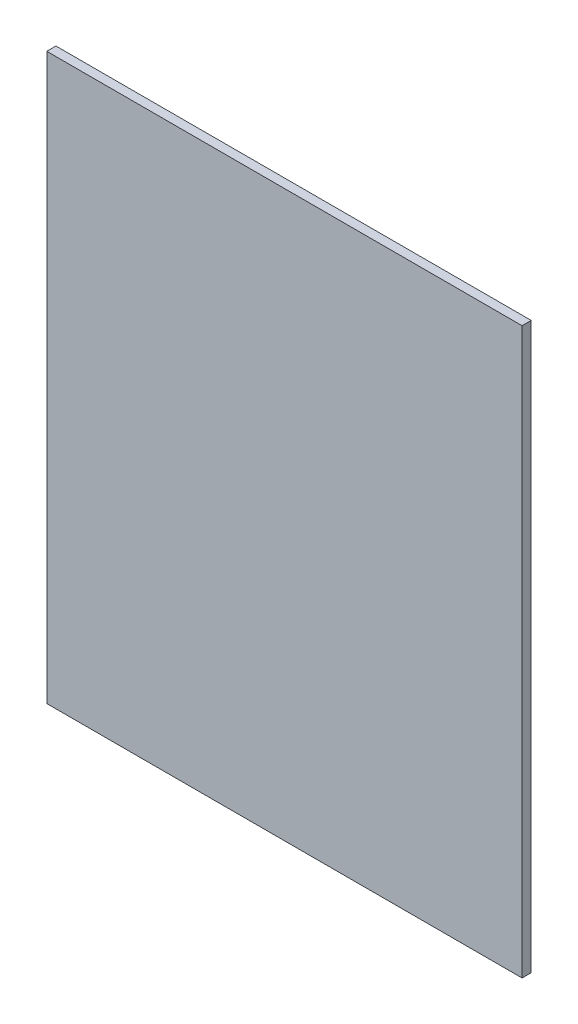
ISO-10303-21;
HEADER;
FILE_DESCRIPTION(('STEP AP214'),'2;1');
FILE_NAME('part.step','',(''),(''),'','','');
FILE_SCHEMA(('AUTOMOTIVE_DESIGN { 1 0 10303 214 1 1 1 1 }'));
ENDSEC;
DATA;
#1=APPLICATION_CONTEXT('core data for automotive mechanical design processes');
#2=APPLICATION_PROTOCOL_DEFINITION('international standard','automotive_design',2000,#1);
#3=PRODUCT_CONTEXT('',#1,'mechanical');
#4=PRODUCT('Part','Part','',(#3));
#5=PRODUCT_RELATED_PRODUCT_CATEGORY('part','',(#4));
#6=PRODUCT_DEFINITION_FORMATION('','',#4);
#7=PRODUCT_DEFINITION_CONTEXT('part definition',#1,'design');
#8=PRODUCT_DEFINITION('design','',#6,#7);
#9=PRODUCT_DEFINITION_SHAPE('','',#8);
#10=(LENGTH_UNIT() NAMED_UNIT(*) SI_UNIT(.MILLI.,.METRE.));
#11=(NAMED_UNIT(*) PLANE_ANGLE_UNIT() SI_UNIT($,.RADIAN.));
#12=(NAMED_UNIT(*) SI_UNIT($,.STERADIAN.) SOLID_ANGLE_UNIT());
#13=UNCERTAINTY_MEASURE_WITH_UNIT(LENGTH_MEASURE(1.E-05),#10,'distance_accuracy_value','');
#14=(GEOMETRIC_REPRESENTATION_CONTEXT(3) GLOBAL_UNCERTAINTY_ASSIGNED_CONTEXT((#13)) GLOBAL_UNIT_ASSIGNED_CONTEXT((#10,
#11,#12)) REPRESENTATION_CONTEXT('',''));
#15=CARTESIAN_POINT('',(0.,0.,0.));
#16=DIRECTION('',(0.,0.,1.));
#17=DIRECTION('',(1.,0.,0.));
#18=AXIS2_PLACEMENT_3D('',#15,#16,#17);
#19=CARTESIAN_POINT('',(-130.,-154.5,5.));
#20=DIRECTION('',(1.,0.,0.));
#21=DIRECTION('',(0.,0.,-1.));
#22=AXIS2_PLACEMENT_3D('',#19,#20,#21);
#23=PLANE('',#22);
#24=DIRECTION('',(0.,-1.,0.));
#25=VECTOR('',#24,1.);
#26=CARTESIAN_POINT('',(-130.,-154.5,0.));
#27=LINE('',#26,#25);
#28=CARTESIAN_POINT('',(-130.,154.5,0.));
#29=VERTEX_POINT('',#28);
#30=CARTESIAN_POINT('',(-130.,-154.5,0.));
#31=VERTEX_POINT('',#30);
#32=EDGE_CURVE('E96',#29,#31,#27,.T.);
#33=ORIENTED_EDGE('',*,*,#32,.T.);
#34=DIRECTION('',(0.,0.,-1.));
#35=VECTOR('',#34,1.);
#36=CARTESIAN_POINT('',(-130.,-154.5,5.));
#37=LINE('',#36,#35);
#38=CARTESIAN_POINT('',(-130.,-154.5,5.));
#39=VERTEX_POINT('',#38);
#40=EDGE_CURVE('E11',#39,#31,#37,.T.);
#41=ORIENTED_EDGE('',*,*,#40,.F.);
#42=DIRECTION('',(0.,-1.,0.));
#43=VECTOR('',#42,1.);
#44=CARTESIAN_POINT('',(-130.,-154.5,5.));
#45=LINE('',#44,#43);
#46=CARTESIAN_POINT('',(-130.,154.5,5.));
#47=VERTEX_POINT('',#46);
#48=EDGE_CURVE('E84',#47,#39,#45,.T.);
#49=ORIENTED_EDGE('',*,*,#48,.F.);
#50=DIRECTION('',(0.,0.,-1.));
#51=VECTOR('',#50,1.);
#52=CARTESIAN_POINT('',(-130.,154.5,5.));
#53=LINE('',#52,#51);
#54=EDGE_CURVE('E92',#47,#29,#53,.T.);
#55=ORIENTED_EDGE('',*,*,#54,.T.);
#56=EDGE_LOOP('',(#33,#41,#49,#55));
#57=FACE_BOUND('',#56,.T.);
#58=ADVANCED_FACE('F33',(#57),#23,.F.);
#59=CARTESIAN_POINT('',(130.,-154.5,5.));
#60=DIRECTION('',(0.,1.,0.));
#61=DIRECTION('',(0.,0.,1.));
#62=AXIS2_PLACEMENT_3D('',#59,#60,#61);
#63=PLANE('',#62);
#64=DIRECTION('',(1.,0.,0.));
#65=VECTOR('',#64,1.);
#66=CARTESIAN_POINT('',(130.,-154.5,0.));
#67=LINE('',#66,#65);
#68=CARTESIAN_POINT('',(130.,-154.5,0.));
#69=VERTEX_POINT('',#68);
#70=EDGE_CURVE('E88',#31,#69,#67,.T.);
#71=ORIENTED_EDGE('',*,*,#70,.T.);
#72=DIRECTION('',(0.,0.,-1.));
#73=VECTOR('',#72,1.);
#74=CARTESIAN_POINT('',(130.,-154.5,5.));
#75=LINE('',#74,#73);
#76=CARTESIAN_POINT('',(130.,-154.5,5.));
#77=VERTEX_POINT('',#76);
#78=EDGE_CURVE('E41',#77,#69,#75,.T.);
#79=ORIENTED_EDGE('',*,*,#78,.F.);
#80=DIRECTION('',(1.,0.,0.));
#81=VECTOR('',#80,1.);
#82=CARTESIAN_POINT('',(130.,-154.5,5.));
#83=LINE('',#82,#81);
#84=EDGE_CURVE('E79',#39,#77,#83,.T.);
#85=ORIENTED_EDGE('',*,*,#84,.F.);
#86=ORIENTED_EDGE('',*,*,#40,.T.);
#87=EDGE_LOOP('',(#71,#79,#85,#86));
#88=FACE_BOUND('',#87,.T.);
#89=ADVANCED_FACE('F87',(#88),#63,.F.);
#90=CARTESIAN_POINT('',(130.,-154.5,5.));
#91=DIRECTION('',(-1.,0.,0.));
#92=DIRECTION('',(0.,0.,1.));
#93=AXIS2_PLACEMENT_3D('',#90,#91,#92);
#94=PLANE('',#93);
#95=DIRECTION('',(0.,1.,0.));
#96=VECTOR('',#95,1.);
#97=CARTESIAN_POINT('',(130.,-154.5,0.));
#98=LINE('',#97,#96);
#99=CARTESIAN_POINT('',(130.,154.5,0.));
#100=VERTEX_POINT('',#99);
#101=EDGE_CURVE('E66',#69,#100,#98,.T.);
#102=ORIENTED_EDGE('',*,*,#101,.T.);
#103=DIRECTION('',(0.,0.,-1.));
#104=VECTOR('',#103,1.);
#105=CARTESIAN_POINT('',(130.,154.5,5.));
#106=LINE('',#105,#104);
#107=CARTESIAN_POINT('',(130.,154.5,5.));
#108=VERTEX_POINT('',#107);
#109=EDGE_CURVE('E89',#108,#100,#106,.T.);
#110=ORIENTED_EDGE('',*,*,#109,.F.);
#111=DIRECTION('',(0.,1.,0.));
#112=VECTOR('',#111,1.);
#113=CARTESIAN_POINT('',(130.,-154.5,5.));
#114=LINE('',#113,#112);
#115=EDGE_CURVE('E82',#77,#108,#114,.T.);
#116=ORIENTED_EDGE('',*,*,#115,.F.);
#117=ORIENTED_EDGE('',*,*,#78,.T.);
#118=EDGE_LOOP('',(#102,#110,#116,#117));
#119=FACE_BOUND('',#118,.T.);
#120=ADVANCED_FACE('F90',(#119),#94,.F.);
#121=CARTESIAN_POINT('',(130.,154.5,5.));
#122=DIRECTION('',(0.,-1.,0.));
#123=DIRECTION('',(0.,0.,-1.));
#124=AXIS2_PLACEMENT_3D('',#121,#122,#123);
#125=PLANE('',#124);
#126=DIRECTION('',(-1.,0.,0.));
#127=VECTOR('',#126,1.);
#128=CARTESIAN_POINT('',(130.,154.5,0.));
#129=LINE('',#128,#127);
#130=EDGE_CURVE('E72',#100,#29,#129,.T.);
#131=ORIENTED_EDGE('',*,*,#130,.T.);
#132=ORIENTED_EDGE('',*,*,#54,.F.);
#133=DIRECTION('',(-1.,0.,0.));
#134=VECTOR('',#133,1.);
#135=CARTESIAN_POINT('',(130.,154.5,5.));
#136=LINE('',#135,#134);
#137=EDGE_CURVE('E49',#108,#47,#136,.T.);
#138=ORIENTED_EDGE('',*,*,#137,.F.);
#139=ORIENTED_EDGE('',*,*,#109,.T.);
#140=EDGE_LOOP('',(#131,#132,#138,#139));
#141=FACE_BOUND('',#140,.T.);
#142=ADVANCED_FACE('F103',(#141),#125,.F.);
#143=CARTESIAN_POINT('',(0.,0.,5.));
#144=DIRECTION('',(0.,0.,1.));
#145=DIRECTION('',(1.,0.,0.));
#146=AXIS2_PLACEMENT_3D('',#143,#144,#145);
#147=PLANE('',#146);
#148=ORIENTED_EDGE('',*,*,#48,.T.);
#149=ORIENTED_EDGE('',*,*,#84,.T.);
#150=ORIENTED_EDGE('',*,*,#115,.T.);
#151=ORIENTED_EDGE('',*,*,#137,.T.);
#152=EDGE_LOOP('',(#148,#149,#150,#151));
#153=FACE_BOUND('',#152,.T.);
#154=ADVANCED_FACE('F80',(#153),#147,.T.);
#155=CARTESIAN_POINT('',(0.,0.,0.));
#156=DIRECTION('',(0.,0.,1.));
#157=DIRECTION('',(1.,0.,0.));
#158=AXIS2_PLACEMENT_3D('',#155,#156,#157);
#159=PLANE('',#158);
#160=ORIENTED_EDGE('',*,*,#32,.F.);
#161=ORIENTED_EDGE('',*,*,#130,.F.);
#162=ORIENTED_EDGE('',*,*,#101,.F.);
#163=ORIENTED_EDGE('',*,*,#70,.F.);
#164=EDGE_LOOP('',(#160,#161,#162,#163));
#165=FACE_BOUND('',#164,.T.);
#166=ADVANCED_FACE('F106',(#165),#159,.F.);
#167=CLOSED_SHELL('',(#58,#89,#120,#142,#154,#166));
#168=MANIFOLD_SOLID_BREP('B2',#167);
#169=ADVANCED_BREP_SHAPE_REPRESENTATION('',(#18,#168),#14);
#170=SHAPE_DEFINITION_REPRESENTATION(#9,#169);
ENDSEC;
END-ISO-10303-21;
